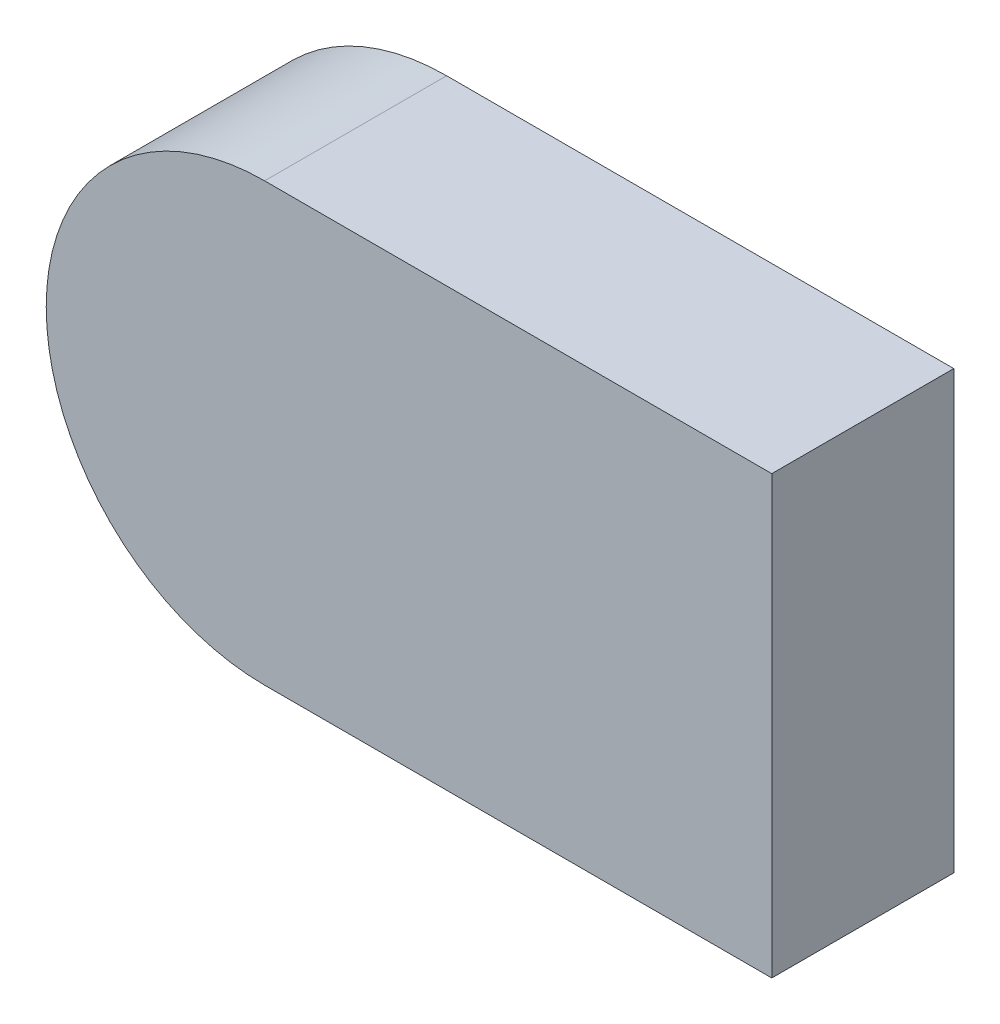
ISO-10303-21;
HEADER;
FILE_DESCRIPTION(('STEP AP214'),'2;1');
FILE_NAME('part.step','',(''),(''),'','','');
FILE_SCHEMA(('AUTOMOTIVE_DESIGN { 1 0 10303 214 1 1 1 1 }'));
ENDSEC;
DATA;
#1=APPLICATION_CONTEXT('core data for automotive mechanical design processes');
#2=APPLICATION_PROTOCOL_DEFINITION('international standard','automotive_design',2000,#1);
#3=PRODUCT_CONTEXT('',#1,'mechanical');
#4=PRODUCT('Part','Part','',(#3));
#5=PRODUCT_RELATED_PRODUCT_CATEGORY('part','',(#4));
#6=PRODUCT_DEFINITION_FORMATION('','',#4);
#7=PRODUCT_DEFINITION_CONTEXT('part definition',#1,'design');
#8=PRODUCT_DEFINITION('design','',#6,#7);
#9=PRODUCT_DEFINITION_SHAPE('','',#8);
#10=(LENGTH_UNIT() NAMED_UNIT(*) SI_UNIT(.MILLI.,.METRE.));
#11=(NAMED_UNIT(*) PLANE_ANGLE_UNIT() SI_UNIT($,.RADIAN.));
#12=(NAMED_UNIT(*) SI_UNIT($,.STERADIAN.) SOLID_ANGLE_UNIT());
#13=UNCERTAINTY_MEASURE_WITH_UNIT(LENGTH_MEASURE(1.E-05),#10,'distance_accuracy_value','');
#14=(GEOMETRIC_REPRESENTATION_CONTEXT(3) GLOBAL_UNCERTAINTY_ASSIGNED_CONTEXT((#13)) GLOBAL_UNIT_ASSIGNED_CONTEXT((#10,
#11,#12)) REPRESENTATION_CONTEXT('',''));
#15=CARTESIAN_POINT('',(0.,0.,0.));
#16=DIRECTION('',(0.,0.,1.));
#17=DIRECTION('',(1.,0.,0.));
#18=AXIS2_PLACEMENT_3D('',#15,#16,#17);
#19=CARTESIAN_POINT('',(0.518501599607,0.4,0.075));
#20=DIRECTION('',(0.,0.,-1.));
#21=DIRECTION('',(-1.,0.,0.));
#22=AXIS2_PLACEMENT_3D('',#19,#20,#21);
#23=PLANE('',#22);
#24=DIRECTION('',(1.,0.,0.));
#25=VECTOR('',#24,1.);
#26=CARTESIAN_POINT('',(0.65,0.49,0.075));
#27=LINE('',#26,#25);
#28=CARTESIAN_POINT('',(0.65,0.49,0.075));
#29=VERTEX_POINT('',#28);
#30=CARTESIAN_POINT('',(0.441,0.49,0.075));
#31=VERTEX_POINT('',#30);
#32=EDGE_CURVE('E59',#29,#31,#27,.F.);
#33=ORIENTED_EDGE('',*,*,#32,.T.);
#34=CARTESIAN_POINT('',(0.441,0.4,0.075));
#35=DIRECTION('',(0.,0.,-1.));
#36=DIRECTION('',(-1.,0.,0.));
#37=AXIS2_PLACEMENT_3D('',#34,#35,#36);
#38=CIRCLE('',#37,0.09);
#39=CARTESIAN_POINT('',(0.441,0.31,0.075));
#40=VERTEX_POINT('',#39);
#41=EDGE_CURVE('E20',#40,#31,#38,.T.);
#42=ORIENTED_EDGE('',*,*,#41,.F.);
#43=DIRECTION('',(1.,0.,0.));
#44=VECTOR('',#43,1.);
#45=CARTESIAN_POINT('',(0.65,0.31,0.075));
#46=LINE('',#45,#44);
#47=CARTESIAN_POINT('',(0.65,0.31,0.075));
#48=VERTEX_POINT('',#47);
#49=EDGE_CURVE('E55',#48,#40,#46,.F.);
#50=ORIENTED_EDGE('',*,*,#49,.F.);
#51=DIRECTION('',(0.,1.,0.));
#52=VECTOR('',#51,1.);
#53=CARTESIAN_POINT('',(0.65,0.31,0.075));
#54=LINE('',#53,#52);
#55=EDGE_CURVE('E63',#48,#29,#54,.T.);
#56=ORIENTED_EDGE('',*,*,#55,.T.);
#57=EDGE_LOOP('',(#33,#42,#50,#56));
#58=FACE_BOUND('',#57,.T.);
#59=ADVANCED_FACE('F17',(#58),#23,.F.);
#60=CARTESIAN_POINT('',(0.65,0.31,0.));
#61=DIRECTION('',(0.,-1.,0.));
#62=DIRECTION('',(0.,0.,-1.));
#63=AXIS2_PLACEMENT_3D('',#60,#61,#62);
#64=PLANE('',#63);
#65=DIRECTION('',(0.,0.,-1.));
#66=VECTOR('',#65,1.);
#67=CARTESIAN_POINT('',(0.441,0.31,0.));
#68=LINE('',#67,#66);
#69=CARTESIAN_POINT('',(0.441,0.31,0.));
#70=VERTEX_POINT('',#69);
#71=EDGE_CURVE('E70',#70,#40,#68,.F.);
#72=ORIENTED_EDGE('',*,*,#71,.F.);
#73=DIRECTION('',(-1.,0.,0.));
#74=VECTOR('',#73,1.);
#75=CARTESIAN_POINT('',(0.518501599607,0.31,0.));
#76=LINE('',#75,#74);
#77=CARTESIAN_POINT('',(0.65,0.31,0.));
#78=VERTEX_POINT('',#77);
#79=EDGE_CURVE('E84',#78,#70,#76,.T.);
#80=ORIENTED_EDGE('',*,*,#79,.F.);
#81=DIRECTION('',(0.,0.,1.));
#82=VECTOR('',#81,1.);
#83=CARTESIAN_POINT('',(0.65,0.31,0.));
#84=LINE('',#83,#82);
#85=EDGE_CURVE('E74',#78,#48,#84,.T.);
#86=ORIENTED_EDGE('',*,*,#85,.T.);
#87=ORIENTED_EDGE('',*,*,#49,.T.);
#88=EDGE_LOOP('',(#72,#80,#86,#87));
#89=FACE_BOUND('',#88,.T.);
#90=ADVANCED_FACE('F105',(#89),#64,.T.);
#91=CARTESIAN_POINT('',(0.441,0.4,0.));
#92=DIRECTION('',(0.,0.,-1.));
#93=DIRECTION('',(-1.,0.,0.));
#94=AXIS2_PLACEMENT_3D('',#91,#92,#93);
#95=CYLINDRICAL_SURFACE('',#94,0.09);
#96=ORIENTED_EDGE('',*,*,#41,.T.);
#97=DIRECTION('',(0.,0.,-1.));
#98=VECTOR('',#97,1.);
#99=CARTESIAN_POINT('',(0.441,0.49,0.));
#100=LINE('',#99,#98);
#101=CARTESIAN_POINT('',(0.441,0.49,0.));
#102=VERTEX_POINT('',#101);
#103=EDGE_CURVE('E65',#31,#102,#100,.T.);
#104=ORIENTED_EDGE('',*,*,#103,.T.);
#105=CARTESIAN_POINT('',(0.441,0.4,0.));
#106=DIRECTION('',(0.,0.,-1.));
#107=DIRECTION('',(-1.,0.,0.));
#108=AXIS2_PLACEMENT_3D('',#105,#106,#107);
#109=CIRCLE('',#108,0.09);
#110=EDGE_CURVE('E97',#70,#102,#109,.T.);
#111=ORIENTED_EDGE('',*,*,#110,.F.);
#112=ORIENTED_EDGE('',*,*,#71,.T.);
#113=EDGE_LOOP('',(#96,#104,#111,#112));
#114=FACE_BOUND('',#113,.T.);
#115=ADVANCED_FACE('F68',(#114),#95,.T.);
#116=CARTESIAN_POINT('',(0.65,0.49,0.));
#117=DIRECTION('',(0.,-1.,0.));
#118=DIRECTION('',(0.,0.,-1.));
#119=AXIS2_PLACEMENT_3D('',#116,#117,#118);
#120=PLANE('',#119);
#121=ORIENTED_EDGE('',*,*,#103,.F.);
#122=ORIENTED_EDGE('',*,*,#32,.F.);
#123=DIRECTION('',(0.,0.,1.));
#124=VECTOR('',#123,1.);
#125=CARTESIAN_POINT('',(0.65,0.49,0.));
#126=LINE('',#125,#124);
#127=CARTESIAN_POINT('',(0.65,0.49,0.));
#128=VERTEX_POINT('',#127);
#129=EDGE_CURVE('E35',#29,#128,#126,.F.);
#130=ORIENTED_EDGE('',*,*,#129,.T.);
#131=DIRECTION('',(-1.,0.,0.));
#132=VECTOR('',#131,1.);
#133=CARTESIAN_POINT('',(0.518501599607,0.49,0.));
#134=LINE('',#133,#132);
#135=EDGE_CURVE('E26',#102,#128,#134,.F.);
#136=ORIENTED_EDGE('',*,*,#135,.F.);
#137=EDGE_LOOP('',(#121,#122,#130,#136));
#138=FACE_BOUND('',#137,.T.);
#139=ADVANCED_FACE('F71',(#138),#120,.F.);
#140=CARTESIAN_POINT('',(0.65,0.31,0.));
#141=DIRECTION('',(-1.,0.,0.));
#142=DIRECTION('',(0.,0.,1.));
#143=AXIS2_PLACEMENT_3D('',#140,#141,#142);
#144=PLANE('',#143);
#145=ORIENTED_EDGE('',*,*,#129,.F.);
#146=ORIENTED_EDGE('',*,*,#55,.F.);
#147=ORIENTED_EDGE('',*,*,#85,.F.);
#148=DIRECTION('',(0.,1.,0.));
#149=VECTOR('',#148,1.);
#150=CARTESIAN_POINT('',(0.65,0.4,0.));
#151=LINE('',#150,#149);
#152=EDGE_CURVE('E11',#128,#78,#151,.F.);
#153=ORIENTED_EDGE('',*,*,#152,.F.);
#154=EDGE_LOOP('',(#145,#146,#147,#153));
#155=FACE_BOUND('',#154,.T.);
#156=ADVANCED_FACE('F107',(#155),#144,.F.);
#157=CARTESIAN_POINT('',(0.518501599607,0.4,0.));
#158=DIRECTION('',(0.,0.,-1.));
#159=DIRECTION('',(-1.,0.,0.));
#160=AXIS2_PLACEMENT_3D('',#157,#158,#159);
#161=PLANE('',#160);
#162=ORIENTED_EDGE('',*,*,#135,.T.);
#163=ORIENTED_EDGE('',*,*,#152,.T.);
#164=ORIENTED_EDGE('',*,*,#79,.T.);
#165=ORIENTED_EDGE('',*,*,#110,.T.);
#166=EDGE_LOOP('',(#162,#163,#164,#165));
#167=FACE_BOUND('',#166,.T.);
#168=ADVANCED_FACE('F103',(#167),#161,.T.);
#169=CLOSED_SHELL('',(#59,#90,#115,#139,#156,#168));
#170=MANIFOLD_SOLID_BREP('B1',#169);
#171=ADVANCED_BREP_SHAPE_REPRESENTATION('',(#18,#170),#14);
#172=SHAPE_DEFINITION_REPRESENTATION(#9,#171);
ENDSEC;
END-ISO-10303-21;
